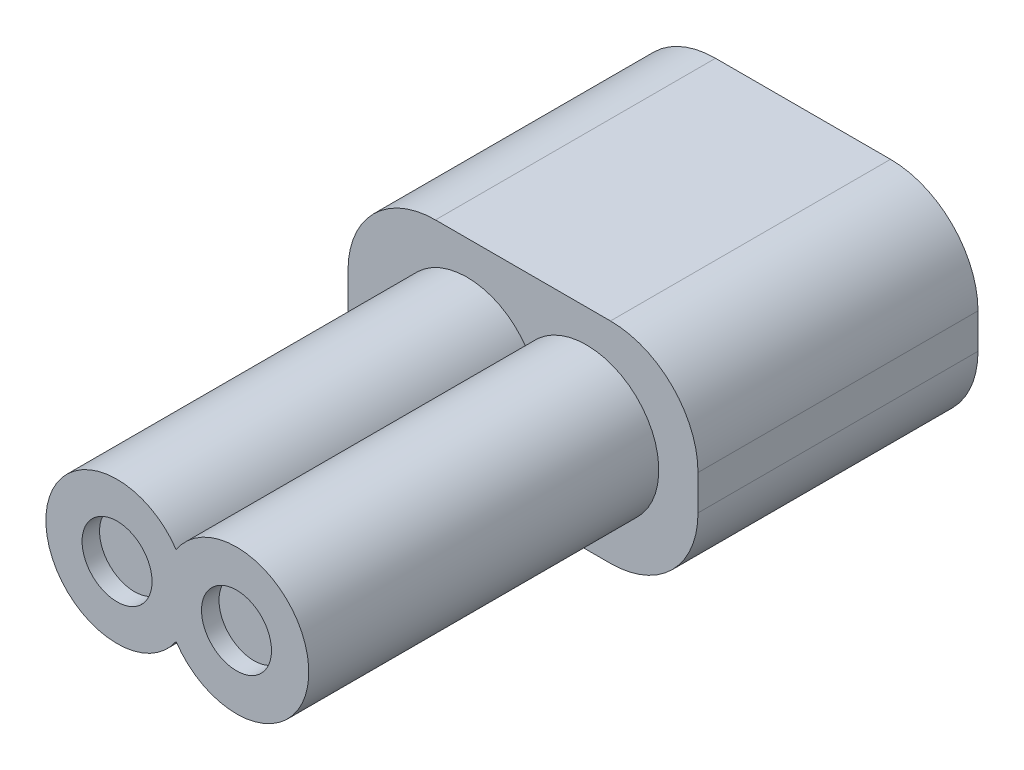
ISO-10303-21;
HEADER;
FILE_DESCRIPTION(('STEP AP214'),'2;1');
FILE_NAME('part.step','',(''),(''),'','','');
FILE_SCHEMA(('AUTOMOTIVE_DESIGN { 1 0 10303 214 1 1 1 1 }'));
ENDSEC;
DATA;
#1=APPLICATION_CONTEXT('core data for automotive mechanical design processes');
#2=APPLICATION_PROTOCOL_DEFINITION('international standard','automotive_design',2000,#1);
#3=PRODUCT_CONTEXT('',#1,'mechanical');
#4=PRODUCT('Part','Part','',(#3));
#5=PRODUCT_RELATED_PRODUCT_CATEGORY('part','',(#4));
#6=PRODUCT_DEFINITION_FORMATION('','',#4);
#7=PRODUCT_DEFINITION_CONTEXT('part definition',#1,'design');
#8=PRODUCT_DEFINITION('design','',#6,#7);
#9=PRODUCT_DEFINITION_SHAPE('','',#8);
#10=(LENGTH_UNIT() NAMED_UNIT(*) SI_UNIT(.MILLI.,.METRE.));
#11=(NAMED_UNIT(*) PLANE_ANGLE_UNIT() SI_UNIT($,.RADIAN.));
#12=(NAMED_UNIT(*) SI_UNIT($,.STERADIAN.) SOLID_ANGLE_UNIT());
#13=UNCERTAINTY_MEASURE_WITH_UNIT(LENGTH_MEASURE(1.E-05),#10,'distance_accuracy_value','');
#14=(GEOMETRIC_REPRESENTATION_CONTEXT(3) GLOBAL_UNCERTAINTY_ASSIGNED_CONTEXT((#13)) GLOBAL_UNIT_ASSIGNED_CONTEXT((#10,
#11,#12)) REPRESENTATION_CONTEXT('',''));
#15=CARTESIAN_POINT('',(0.,0.,0.));
#16=DIRECTION('',(0.,0.,1.));
#17=DIRECTION('',(1.,0.,0.));
#18=AXIS2_PLACEMENT_3D('',#15,#16,#17);
#19=CARTESIAN_POINT('',(15.,5.,16.));
#20=DIRECTION('',(0.,0.,-1.));
#21=DIRECTION('',(-1.,0.,0.));
#22=AXIS2_PLACEMENT_3D('',#19,#20,#21);
#23=CYLINDRICAL_SURFACE('',#22,5.);
#24=CARTESIAN_POINT('',(15.,5.,0.));
#25=DIRECTION('',(0.,0.,1.));
#26=DIRECTION('',(1.,0.,0.));
#27=AXIS2_PLACEMENT_3D('',#24,#25,#26);
#28=CIRCLE('',#27,5.);
#29=CARTESIAN_POINT('',(15.,0.,0.));
#30=VERTEX_POINT('',#29);
#31=CARTESIAN_POINT('',(20.,5.00000000000004,0.));
#32=VERTEX_POINT('',#31);
#33=EDGE_CURVE('E152',#30,#32,#28,.T.);
#34=ORIENTED_EDGE('',*,*,#33,.T.);
#35=DIRECTION('',(0.,0.,-1.));
#36=VECTOR('',#35,1.);
#37=CARTESIAN_POINT('',(20.,5.00000000000004,16.));
#38=LINE('',#37,#36);
#39=CARTESIAN_POINT('',(20.,5.00000000000004,16.));
#40=VERTEX_POINT('',#39);
#41=EDGE_CURVE('E11',#40,#32,#38,.T.);
#42=ORIENTED_EDGE('',*,*,#41,.F.);
#43=CARTESIAN_POINT('',(15.,5.,16.));
#44=DIRECTION('',(0.,0.,1.));
#45=DIRECTION('',(1.,0.,0.));
#46=AXIS2_PLACEMENT_3D('',#43,#44,#45);
#47=CIRCLE('',#46,5.);
#48=CARTESIAN_POINT('',(15.,0.,16.));
#49=VERTEX_POINT('',#48);
#50=EDGE_CURVE('E176',#49,#40,#47,.T.);
#51=ORIENTED_EDGE('',*,*,#50,.F.);
#52=DIRECTION('',(0.,0.,-1.));
#53=VECTOR('',#52,1.);
#54=CARTESIAN_POINT('',(15.,0.,16.));
#55=LINE('',#54,#53);
#56=EDGE_CURVE('E148',#49,#30,#55,.T.);
#57=ORIENTED_EDGE('',*,*,#56,.T.);
#58=EDGE_LOOP('',(#34,#42,#51,#57));
#59=FACE_BOUND('',#58,.T.);
#60=ADVANCED_FACE('F39',(#59),#23,.T.);
#61=CARTESIAN_POINT('',(20.,5.00000000000004,16.));
#62=DIRECTION('',(-1.,0.,0.));
#63=DIRECTION('',(0.,0.,1.));
#64=AXIS2_PLACEMENT_3D('',#61,#62,#63);
#65=PLANE('',#64);
#66=DIRECTION('',(0.,1.,0.));
#67=VECTOR('',#66,1.);
#68=CARTESIAN_POINT('',(20.,5.00000000000004,0.));
#69=LINE('',#68,#67);
#70=CARTESIAN_POINT('',(20.,6.99999999999997,0.));
#71=VERTEX_POINT('',#70);
#72=EDGE_CURVE('E156',#32,#71,#69,.T.);
#73=ORIENTED_EDGE('',*,*,#72,.T.);
#74=DIRECTION('',(0.,0.,-1.));
#75=VECTOR('',#74,1.);
#76=CARTESIAN_POINT('',(20.,6.99999999999997,16.));
#77=LINE('',#76,#75);
#78=CARTESIAN_POINT('',(20.,6.99999999999997,16.));
#79=VERTEX_POINT('',#78);
#80=EDGE_CURVE('E47',#79,#71,#77,.T.);
#81=ORIENTED_EDGE('',*,*,#80,.F.);
#82=DIRECTION('',(0.,1.,0.));
#83=VECTOR('',#82,1.);
#84=CARTESIAN_POINT('',(20.,5.00000000000004,16.));
#85=LINE('',#84,#83);
#86=EDGE_CURVE('E104',#40,#79,#85,.T.);
#87=ORIENTED_EDGE('',*,*,#86,.F.);
#88=ORIENTED_EDGE('',*,*,#41,.T.);
#89=EDGE_LOOP('',(#73,#81,#87,#88));
#90=FACE_BOUND('',#89,.T.);
#91=ADVANCED_FACE('F293',(#90),#65,.F.);
#92=CARTESIAN_POINT('',(15.,7.,16.));
#93=DIRECTION('',(0.,0.,-1.));
#94=DIRECTION('',(-1.,0.,0.));
#95=AXIS2_PLACEMENT_3D('',#92,#93,#94);
#96=CYLINDRICAL_SURFACE('',#95,5.);
#97=CARTESIAN_POINT('',(15.,7.,0.));
#98=DIRECTION('',(0.,0.,1.));
#99=DIRECTION('',(-1.,0.,0.));
#100=AXIS2_PLACEMENT_3D('',#97,#98,#99);
#101=CIRCLE('',#100,5.);
#102=CARTESIAN_POINT('',(15.,12.,0.));
#103=VERTEX_POINT('',#102);
#104=EDGE_CURVE('E160',#71,#103,#101,.T.);
#105=ORIENTED_EDGE('',*,*,#104,.T.);
#106=DIRECTION('',(0.,0.,-1.));
#107=VECTOR('',#106,1.);
#108=CARTESIAN_POINT('',(15.,12.,16.));
#109=LINE('',#108,#107);
#110=CARTESIAN_POINT('',(15.,12.,16.));
#111=VERTEX_POINT('',#110);
#112=EDGE_CURVE('E187',#111,#103,#109,.T.);
#113=ORIENTED_EDGE('',*,*,#112,.F.);
#114=CARTESIAN_POINT('',(15.,7.,16.));
#115=DIRECTION('',(0.,0.,1.));
#116=DIRECTION('',(-1.,0.,0.));
#117=AXIS2_PLACEMENT_3D('',#114,#115,#116);
#118=CIRCLE('',#117,5.);
#119=EDGE_CURVE('E197',#79,#111,#118,.T.);
#120=ORIENTED_EDGE('',*,*,#119,.F.);
#121=ORIENTED_EDGE('',*,*,#80,.T.);
#122=EDGE_LOOP('',(#105,#113,#120,#121));
#123=FACE_BOUND('',#122,.T.);
#124=ADVANCED_FACE('F195',(#123),#96,.T.);
#125=CARTESIAN_POINT('',(5.00000000000004,12.,16.));
#126=DIRECTION('',(0.,-1.,0.));
#127=DIRECTION('',(0.,0.,-1.));
#128=AXIS2_PLACEMENT_3D('',#125,#126,#127);
#129=PLANE('',#128);
#130=DIRECTION('',(-1.,0.,0.));
#131=VECTOR('',#130,1.);
#132=CARTESIAN_POINT('',(5.00000000000004,12.,0.));
#133=LINE('',#132,#131);
#134=CARTESIAN_POINT('',(5.00000000000004,12.,0.));
#135=VERTEX_POINT('',#134);
#136=EDGE_CURVE('E163',#103,#135,#133,.T.);
#137=ORIENTED_EDGE('',*,*,#136,.T.);
#138=DIRECTION('',(0.,0.,-1.));
#139=VECTOR('',#138,1.);
#140=CARTESIAN_POINT('',(5.00000000000004,12.,16.));
#141=LINE('',#140,#139);
#142=CARTESIAN_POINT('',(5.00000000000004,12.,16.));
#143=VERTEX_POINT('',#142);
#144=EDGE_CURVE('E183',#143,#135,#141,.T.);
#145=ORIENTED_EDGE('',*,*,#144,.F.);
#146=DIRECTION('',(-1.,0.,0.));
#147=VECTOR('',#146,1.);
#148=CARTESIAN_POINT('',(5.00000000000004,12.,16.));
#149=LINE('',#148,#147);
#150=EDGE_CURVE('E210',#111,#143,#149,.T.);
#151=ORIENTED_EDGE('',*,*,#150,.F.);
#152=ORIENTED_EDGE('',*,*,#112,.T.);
#153=EDGE_LOOP('',(#137,#145,#151,#152));
#154=FACE_BOUND('',#153,.T.);
#155=ADVANCED_FACE('F205',(#154),#129,.F.);
#156=CARTESIAN_POINT('',(5.,7.,16.));
#157=DIRECTION('',(0.,0.,-1.));
#158=DIRECTION('',(-1.,0.,0.));
#159=AXIS2_PLACEMENT_3D('',#156,#157,#158);
#160=CYLINDRICAL_SURFACE('',#159,5.);
#161=CARTESIAN_POINT('',(5.,7.,0.));
#162=DIRECTION('',(0.,0.,1.));
#163=DIRECTION('',(-1.,0.,0.));
#164=AXIS2_PLACEMENT_3D('',#161,#162,#163);
#165=CIRCLE('',#164,5.);
#166=CARTESIAN_POINT('',(0.,6.99999999999997,0.));
#167=VERTEX_POINT('',#166);
#168=EDGE_CURVE('E166',#135,#167,#165,.T.);
#169=ORIENTED_EDGE('',*,*,#168,.T.);
#170=DIRECTION('',(0.,0.,-1.));
#171=VECTOR('',#170,1.);
#172=CARTESIAN_POINT('',(0.,6.99999999999997,16.));
#173=LINE('',#172,#171);
#174=CARTESIAN_POINT('',(0.,6.99999999999997,16.));
#175=VERTEX_POINT('',#174);
#176=EDGE_CURVE('E141',#175,#167,#173,.T.);
#177=ORIENTED_EDGE('',*,*,#176,.F.);
#178=CARTESIAN_POINT('',(5.,7.,16.));
#179=DIRECTION('',(0.,0.,1.));
#180=DIRECTION('',(-1.,0.,0.));
#181=AXIS2_PLACEMENT_3D('',#178,#179,#180);
#182=CIRCLE('',#181,5.);
#183=EDGE_CURVE('E127',#143,#175,#182,.T.);
#184=ORIENTED_EDGE('',*,*,#183,.F.);
#185=ORIENTED_EDGE('',*,*,#144,.T.);
#186=EDGE_LOOP('',(#169,#177,#184,#185));
#187=FACE_BOUND('',#186,.T.);
#188=ADVANCED_FACE('F208',(#187),#160,.T.);
#189=CARTESIAN_POINT('',(0.,5.00000000000004,16.));
#190=DIRECTION('',(1.,0.,0.));
#191=DIRECTION('',(0.,0.,-1.));
#192=AXIS2_PLACEMENT_3D('',#189,#190,#191);
#193=PLANE('',#192);
#194=DIRECTION('',(0.,-1.,0.));
#195=VECTOR('',#194,1.);
#196=CARTESIAN_POINT('',(0.,5.00000000000004,0.));
#197=LINE('',#196,#195);
#198=CARTESIAN_POINT('',(0.,5.00000000000004,0.));
#199=VERTEX_POINT('',#198);
#200=EDGE_CURVE('E137',#167,#199,#197,.T.);
#201=ORIENTED_EDGE('',*,*,#200,.T.);
#202=DIRECTION('',(0.,0.,-1.));
#203=VECTOR('',#202,1.);
#204=CARTESIAN_POINT('',(0.,5.00000000000004,16.));
#205=LINE('',#204,#203);
#206=CARTESIAN_POINT('',(0.,5.00000000000004,16.));
#207=VERTEX_POINT('',#206);
#208=EDGE_CURVE('E134',#207,#199,#205,.T.);
#209=ORIENTED_EDGE('',*,*,#208,.F.);
#210=DIRECTION('',(0.,-1.,0.));
#211=VECTOR('',#210,1.);
#212=CARTESIAN_POINT('',(0.,5.00000000000004,16.));
#213=LINE('',#212,#211);
#214=EDGE_CURVE('E120',#175,#207,#213,.T.);
#215=ORIENTED_EDGE('',*,*,#214,.F.);
#216=ORIENTED_EDGE('',*,*,#176,.T.);
#217=EDGE_LOOP('',(#201,#209,#215,#216));
#218=FACE_BOUND('',#217,.T.);
#219=ADVANCED_FACE('F135',(#218),#193,.F.);
#220=CARTESIAN_POINT('',(5.,5.,16.));
#221=DIRECTION('',(0.,0.,-1.));
#222=DIRECTION('',(-1.,0.,0.));
#223=AXIS2_PLACEMENT_3D('',#220,#221,#222);
#224=CYLINDRICAL_SURFACE('',#223,5.);
#225=CARTESIAN_POINT('',(5.,5.,0.));
#226=DIRECTION('',(0.,0.,1.));
#227=DIRECTION('',(-1.,0.,0.));
#228=AXIS2_PLACEMENT_3D('',#225,#226,#227);
#229=CIRCLE('',#228,5.);
#230=CARTESIAN_POINT('',(5.00000000000004,0.,0.));
#231=VERTEX_POINT('',#230);
#232=EDGE_CURVE('E171',#199,#231,#229,.T.);
#233=ORIENTED_EDGE('',*,*,#232,.T.);
#234=DIRECTION('',(0.,0.,-1.));
#235=VECTOR('',#234,1.);
#236=CARTESIAN_POINT('',(5.00000000000004,0.,16.));
#237=LINE('',#236,#235);
#238=CARTESIAN_POINT('',(5.00000000000004,0.,16.));
#239=VERTEX_POINT('',#238);
#240=EDGE_CURVE('E142',#239,#231,#237,.T.);
#241=ORIENTED_EDGE('',*,*,#240,.F.);
#242=CARTESIAN_POINT('',(5.,5.,16.));
#243=DIRECTION('',(0.,0.,1.));
#244=DIRECTION('',(-1.,0.,0.));
#245=AXIS2_PLACEMENT_3D('',#242,#243,#244);
#246=CIRCLE('',#245,5.);
#247=EDGE_CURVE('E124',#207,#239,#246,.T.);
#248=ORIENTED_EDGE('',*,*,#247,.F.);
#249=ORIENTED_EDGE('',*,*,#208,.T.);
#250=EDGE_LOOP('',(#233,#241,#248,#249));
#251=FACE_BOUND('',#250,.T.);
#252=ADVANCED_FACE('F144',(#251),#224,.T.);
#253=CARTESIAN_POINT('',(5.00000000000004,0.,16.));
#254=DIRECTION('',(0.,1.,0.));
#255=DIRECTION('',(0.,0.,1.));
#256=AXIS2_PLACEMENT_3D('',#253,#254,#255);
#257=PLANE('',#256);
#258=DIRECTION('',(1.,0.,0.));
#259=VECTOR('',#258,1.);
#260=CARTESIAN_POINT('',(5.00000000000004,0.,0.));
#261=LINE('',#260,#259);
#262=EDGE_CURVE('E96',#231,#30,#261,.T.);
#263=ORIENTED_EDGE('',*,*,#262,.T.);
#264=ORIENTED_EDGE('',*,*,#56,.F.);
#265=DIRECTION('',(1.,0.,0.));
#266=VECTOR('',#265,1.);
#267=CARTESIAN_POINT('',(5.00000000000004,0.,16.));
#268=LINE('',#267,#266);
#269=EDGE_CURVE('E63',#239,#49,#268,.T.);
#270=ORIENTED_EDGE('',*,*,#269,.F.);
#271=ORIENTED_EDGE('',*,*,#240,.T.);
#272=EDGE_LOOP('',(#263,#264,#270,#271));
#273=FACE_BOUND('',#272,.T.);
#274=ADVANCED_FACE('F283',(#273),#257,.F.);
#275=CARTESIAN_POINT('',(15.,5.,16.));
#276=DIRECTION('',(0.,0.,1.));
#277=DIRECTION('',(1.,0.,0.));
#278=AXIS2_PLACEMENT_3D('',#275,#276,#277);
#279=PLANE('',#278);
#280=CARTESIAN_POINT('',(13.6288070117205,6.,16.));
#281=DIRECTION('',(0.,0.,1.));
#282=DIRECTION('',(1.,0.,0.));
#283=AXIS2_PLACEMENT_3D('',#280,#281,#282);
#284=CIRCLE('',#283,4.13122048332697);
#285=CARTESIAN_POINT('',(10.1785308782446,3.72786943935274,16.));
#286=VERTEX_POINT('',#285);
#287=CARTESIAN_POINT('',(10.1785308782446,8.27213056064726,16.));
#288=VERTEX_POINT('',#287);
#289=EDGE_CURVE('E226',#286,#288,#284,.T.);
#290=ORIENTED_EDGE('',*,*,#289,.F.);
#291=CARTESIAN_POINT('',(6.80389626338981,6.,16.));
#292=DIRECTION('',(0.,0.,1.));
#293=DIRECTION('',(1.,0.,0.));
#294=AXIS2_PLACEMENT_3D('',#291,#292,#293);
#295=CIRCLE('',#294,4.06825958714578);
#296=EDGE_CURVE('E54',#288,#286,#295,.T.);
#297=ORIENTED_EDGE('',*,*,#296,.F.);
#298=EDGE_LOOP('',(#290,#297));
#299=FACE_BOUND('',#298,.T.);
#300=ORIENTED_EDGE('',*,*,#50,.T.);
#301=ORIENTED_EDGE('',*,*,#86,.T.);
#302=ORIENTED_EDGE('',*,*,#119,.T.);
#303=ORIENTED_EDGE('',*,*,#150,.T.);
#304=ORIENTED_EDGE('',*,*,#183,.T.);
#305=ORIENTED_EDGE('',*,*,#214,.T.);
#306=ORIENTED_EDGE('',*,*,#247,.T.);
#307=ORIENTED_EDGE('',*,*,#269,.T.);
#308=EDGE_LOOP('',(#300,#301,#302,#303,#304,#305,#306,#307));
#309=FACE_BOUND('',#308,.T.);
#310=ADVANCED_FACE('F122',(#299,#309),#279,.T.);
#311=CARTESIAN_POINT('',(15.,5.,0.));
#312=DIRECTION('',(0.,0.,1.));
#313=DIRECTION('',(1.,0.,0.));
#314=AXIS2_PLACEMENT_3D('',#311,#312,#313);
#315=PLANE('',#314);
#316=ORIENTED_EDGE('',*,*,#33,.F.);
#317=ORIENTED_EDGE('',*,*,#262,.F.);
#318=ORIENTED_EDGE('',*,*,#232,.F.);
#319=ORIENTED_EDGE('',*,*,#200,.F.);
#320=ORIENTED_EDGE('',*,*,#168,.F.);
#321=ORIENTED_EDGE('',*,*,#136,.F.);
#322=ORIENTED_EDGE('',*,*,#104,.F.);
#323=ORIENTED_EDGE('',*,*,#72,.F.);
#324=EDGE_LOOP('',(#316,#317,#318,#319,#320,#321,#322,#323));
#325=FACE_BOUND('',#324,.T.);
#326=ADVANCED_FACE('F201',(#325),#315,.F.);
#327=CARTESIAN_POINT('',(6.80389626338981,6.,36.));
#328=DIRECTION('',(0.,0.,-1.));
#329=DIRECTION('',(-1.,0.,0.));
#330=AXIS2_PLACEMENT_3D('',#327,#328,#329);
#331=CYLINDRICAL_SURFACE('',#330,4.06825958714578);
#332=ORIENTED_EDGE('',*,*,#296,.T.);
#333=DIRECTION('',(0.,0.,-1.));
#334=VECTOR('',#333,1.);
#335=CARTESIAN_POINT('',(10.1785308782446,3.72786943935274,36.));
#336=LINE('',#335,#334);
#337=CARTESIAN_POINT('',(10.1785308782446,3.72786943935274,36.));
#338=VERTEX_POINT('',#337);
#339=EDGE_CURVE('E157',#338,#286,#336,.T.);
#340=ORIENTED_EDGE('',*,*,#339,.F.);
#341=CARTESIAN_POINT('',(6.80389626338981,6.,36.));
#342=DIRECTION('',(0.,0.,1.));
#343=DIRECTION('',(1.,0.,0.));
#344=AXIS2_PLACEMENT_3D('',#341,#342,#343);
#345=CIRCLE('',#344,4.06825958714578);
#346=CARTESIAN_POINT('',(10.1785308782446,8.27213056064726,36.));
#347=VERTEX_POINT('',#346);
#348=EDGE_CURVE('E230',#347,#338,#345,.T.);
#349=ORIENTED_EDGE('',*,*,#348,.F.);
#350=DIRECTION('',(0.,0.,-1.));
#351=VECTOR('',#350,1.);
#352=CARTESIAN_POINT('',(10.1785308782446,8.27213056064726,36.));
#353=LINE('',#352,#351);
#354=EDGE_CURVE('E222',#347,#288,#353,.T.);
#355=ORIENTED_EDGE('',*,*,#354,.T.);
#356=EDGE_LOOP('',(#332,#340,#349,#355));
#357=FACE_BOUND('',#356,.T.);
#358=ADVANCED_FACE('F278',(#357),#331,.T.);
#359=CARTESIAN_POINT('',(13.6288070117205,6.,36.));
#360=DIRECTION('',(0.,0.,-1.));
#361=DIRECTION('',(-1.,0.,0.));
#362=AXIS2_PLACEMENT_3D('',#359,#360,#361);
#363=CYLINDRICAL_SURFACE('',#362,4.13122048332697);
#364=ORIENTED_EDGE('',*,*,#289,.T.);
#365=ORIENTED_EDGE('',*,*,#354,.F.);
#366=CARTESIAN_POINT('',(13.6288070117205,6.,36.));
#367=DIRECTION('',(0.,0.,1.));
#368=DIRECTION('',(1.,0.,0.));
#369=AXIS2_PLACEMENT_3D('',#366,#367,#368);
#370=CIRCLE('',#369,4.13122048332697);
#371=EDGE_CURVE('E225',#338,#347,#370,.T.);
#372=ORIENTED_EDGE('',*,*,#371,.F.);
#373=ORIENTED_EDGE('',*,*,#339,.T.);
#374=EDGE_LOOP('',(#364,#365,#372,#373));
#375=FACE_BOUND('',#374,.T.);
#376=ADVANCED_FACE('F269',(#375),#363,.T.);
#377=CARTESIAN_POINT('',(10.2163516375552,6.,36.));
#378=DIRECTION('',(0.,0.,1.));
#379=DIRECTION('',(1.,0.,0.));
#380=AXIS2_PLACEMENT_3D('',#377,#378,#379);
#381=PLANE('',#380);
#382=CARTESIAN_POINT('',(13.6288070117205,6.,36.));
#383=DIRECTION('',(0.,0.,1.));
#384=DIRECTION('',(1.,0.,0.));
#385=AXIS2_PLACEMENT_3D('',#382,#383,#384);
#386=CIRCLE('',#385,2.);
#387=CARTESIAN_POINT('',(15.6288070117205,6.,36.));
#388=VERTEX_POINT('',#387);
#389=EDGE_CURVE('E248',#388,#388,#386,.T.);
#390=ORIENTED_EDGE('',*,*,#389,.F.);
#391=EDGE_LOOP('',(#390));
#392=FACE_BOUND('',#391,.T.);
#393=CARTESIAN_POINT('',(6.80389626338981,6.,36.));
#394=DIRECTION('',(0.,0.,1.));
#395=DIRECTION('',(1.,0.,0.));
#396=AXIS2_PLACEMENT_3D('',#393,#394,#395);
#397=CIRCLE('',#396,2.);
#398=CARTESIAN_POINT('',(8.80389626338981,6.,36.));
#399=VERTEX_POINT('',#398);
#400=EDGE_CURVE('E240',#399,#399,#397,.T.);
#401=ORIENTED_EDGE('',*,*,#400,.F.);
#402=EDGE_LOOP('',(#401));
#403=FACE_BOUND('',#402,.T.);
#404=ORIENTED_EDGE('',*,*,#348,.T.);
#405=ORIENTED_EDGE('',*,*,#371,.T.);
#406=EDGE_LOOP('',(#404,#405));
#407=FACE_BOUND('',#406,.T.);
#408=ADVANCED_FACE('F265',(#392,#403,#407),#381,.T.);
#409=CARTESIAN_POINT('',(6.80389626338981,6.,35.));
#410=DIRECTION('',(0.,0.,1.));
#411=DIRECTION('',(1.,0.,0.));
#412=AXIS2_PLACEMENT_3D('',#409,#410,#411);
#413=CYLINDRICAL_SURFACE('',#412,2.);
#414=CARTESIAN_POINT('',(6.80389626338981,6.,35.));
#415=DIRECTION('',(0.,0.,1.));
#416=DIRECTION('',(1.,0.,0.));
#417=AXIS2_PLACEMENT_3D('',#414,#415,#416);
#418=CIRCLE('',#417,2.);
#419=CARTESIAN_POINT('',(8.80389626338981,6.,35.));
#420=VERTEX_POINT('',#419);
#421=EDGE_CURVE('E233',#420,#420,#418,.T.);
#422=ORIENTED_EDGE('',*,*,#421,.F.);
#423=EDGE_LOOP('',(#422));
#424=FACE_BOUND('',#423,.T.);
#425=ORIENTED_EDGE('',*,*,#400,.T.);
#426=EDGE_LOOP('',(#425));
#427=FACE_BOUND('',#426,.T.);
#428=ADVANCED_FACE('F268',(#424,#427),#413,.F.);
#429=CARTESIAN_POINT('',(6.80389626338981,6.,35.));
#430=DIRECTION('',(0.,0.,1.));
#431=DIRECTION('',(1.,0.,0.));
#432=AXIS2_PLACEMENT_3D('',#429,#430,#431);
#433=PLANE('',#432);
#434=ORIENTED_EDGE('',*,*,#421,.T.);
#435=EDGE_LOOP('',(#434));
#436=FACE_BOUND('',#435,.T.);
#437=ADVANCED_FACE('F261',(#436),#433,.T.);
#438=CARTESIAN_POINT('',(13.6288070117205,6.,35.));
#439=DIRECTION('',(0.,0.,1.));
#440=DIRECTION('',(1.,0.,0.));
#441=AXIS2_PLACEMENT_3D('',#438,#439,#440);
#442=CYLINDRICAL_SURFACE('',#441,2.);
#443=CARTESIAN_POINT('',(13.6288070117205,6.,35.));
#444=DIRECTION('',(0.,0.,1.));
#445=DIRECTION('',(1.,0.,0.));
#446=AXIS2_PLACEMENT_3D('',#443,#444,#445);
#447=CIRCLE('',#446,2.);
#448=CARTESIAN_POINT('',(15.6288070117205,6.,35.));
#449=VERTEX_POINT('',#448);
#450=EDGE_CURVE('E244',#449,#449,#447,.T.);
#451=ORIENTED_EDGE('',*,*,#450,.F.);
#452=EDGE_LOOP('',(#451));
#453=FACE_BOUND('',#452,.T.);
#454=ORIENTED_EDGE('',*,*,#389,.T.);
#455=EDGE_LOOP('',(#454));
#456=FACE_BOUND('',#455,.T.);
#457=ADVANCED_FACE('F258',(#453,#456),#442,.F.);
#458=CARTESIAN_POINT('',(13.6288070117205,6.,35.));
#459=DIRECTION('',(0.,0.,1.));
#460=DIRECTION('',(1.,0.,0.));
#461=AXIS2_PLACEMENT_3D('',#458,#459,#460);
#462=PLANE('',#461);
#463=ORIENTED_EDGE('',*,*,#450,.T.);
#464=EDGE_LOOP('',(#463));
#465=FACE_BOUND('',#464,.T.);
#466=ADVANCED_FACE('F256',(#465),#462,.T.);
#467=CLOSED_SHELL('',(#60,#91,#124,#155,#188,#219,#252,#274,#310,#326,#358,#376,#408,#428,#437,
#457,#466));
#468=MANIFOLD_SOLID_BREP('B2',#467);
#469=ADVANCED_BREP_SHAPE_REPRESENTATION('',(#18,#468),#14);
#470=SHAPE_DEFINITION_REPRESENTATION(#9,#469);
ENDSEC;
END-ISO-10303-21;
